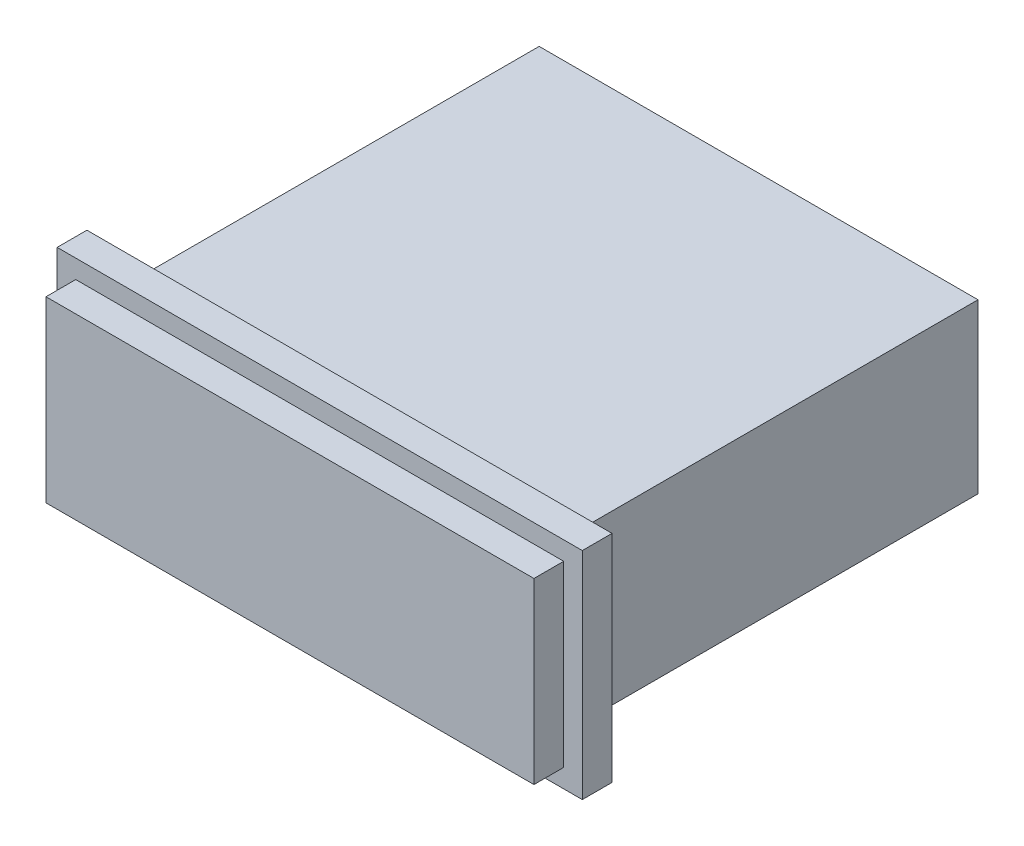
ISO-10303-21;
HEADER;
FILE_DESCRIPTION(('STEP AP214'),'2;1');
FILE_NAME('part.step','',(''),(''),'','','');
FILE_SCHEMA(('AUTOMOTIVE_DESIGN { 1 0 10303 214 1 1 1 1 }'));
ENDSEC;
DATA;
#1=APPLICATION_CONTEXT('core data for automotive mechanical design processes');
#2=APPLICATION_PROTOCOL_DEFINITION('international standard','automotive_design',2000,#1);
#3=PRODUCT_CONTEXT('',#1,'mechanical');
#4=PRODUCT('Part','Part','',(#3));
#5=PRODUCT_RELATED_PRODUCT_CATEGORY('part','',(#4));
#6=PRODUCT_DEFINITION_FORMATION('','',#4);
#7=PRODUCT_DEFINITION_CONTEXT('part definition',#1,'design');
#8=PRODUCT_DEFINITION('design','',#6,#7);
#9=PRODUCT_DEFINITION_SHAPE('','',#8);
#10=(LENGTH_UNIT() NAMED_UNIT(*) SI_UNIT(.MILLI.,.METRE.));
#11=(NAMED_UNIT(*) PLANE_ANGLE_UNIT() SI_UNIT($,.RADIAN.));
#12=(NAMED_UNIT(*) SI_UNIT($,.STERADIAN.) SOLID_ANGLE_UNIT());
#13=UNCERTAINTY_MEASURE_WITH_UNIT(LENGTH_MEASURE(1.E-05),#10,'distance_accuracy_value','');
#14=(GEOMETRIC_REPRESENTATION_CONTEXT(3) GLOBAL_UNCERTAINTY_ASSIGNED_CONTEXT((#13)) GLOBAL_UNIT_ASSIGNED_CONTEXT((#10,
#11,#12)) REPRESENTATION_CONTEXT('',''));
#15=CARTESIAN_POINT('',(0.,0.,0.));
#16=DIRECTION('',(0.,0.,1.));
#17=DIRECTION('',(1.,0.,0.));
#18=AXIS2_PLACEMENT_3D('',#15,#16,#17);
#19=CARTESIAN_POINT('',(17.65,-7.25,-4.));
#20=DIRECTION('',(1.,0.,0.));
#21=DIRECTION('',(0.,0.,-1.));
#22=AXIS2_PLACEMENT_3D('',#19,#20,#21);
#23=PLANE('',#22);
#24=DIRECTION('',(0.,0.,1.));
#25=VECTOR('',#24,1.);
#26=CARTESIAN_POINT('',(17.65,7.25,-4.));
#27=LINE('',#26,#25);
#28=CARTESIAN_POINT('',(17.65,7.25,-4.));
#29=VERTEX_POINT('',#28);
#30=CARTESIAN_POINT('',(17.65,7.25,-2.));
#31=VERTEX_POINT('',#30);
#32=EDGE_CURVE('E66',#29,#31,#27,.T.);
#33=ORIENTED_EDGE('',*,*,#32,.T.);
#34=DIRECTION('',(0.,1.,0.));
#35=VECTOR('',#34,1.);
#36=CARTESIAN_POINT('',(17.65,7.25,-2.));
#37=LINE('',#36,#35);
#38=CARTESIAN_POINT('',(17.65,-7.25,-2.));
#39=VERTEX_POINT('',#38);
#40=EDGE_CURVE('E234',#39,#31,#37,.T.);
#41=ORIENTED_EDGE('',*,*,#40,.F.);
#42=DIRECTION('',(0.,0.,1.));
#43=VECTOR('',#42,1.);
#44=CARTESIAN_POINT('',(17.65,-7.25,-4.));
#45=LINE('',#44,#43);
#46=CARTESIAN_POINT('',(17.65,-7.25,-4.));
#47=VERTEX_POINT('',#46);
#48=EDGE_CURVE('E12',#47,#39,#45,.T.);
#49=ORIENTED_EDGE('',*,*,#48,.F.);
#50=DIRECTION('',(0.,1.,0.));
#51=VECTOR('',#50,1.);
#52=CARTESIAN_POINT('',(17.65,-7.25,-4.));
#53=LINE('',#52,#51);
#54=EDGE_CURVE('E240',#47,#29,#53,.T.);
#55=ORIENTED_EDGE('',*,*,#54,.T.);
#56=EDGE_LOOP('',(#33,#41,#49,#55));
#57=FACE_BOUND('',#56,.T.);
#58=ADVANCED_FACE('F63',(#57),#23,.T.);
#59=CARTESIAN_POINT('',(-17.65,-7.25,-4.));
#60=DIRECTION('',(0.,-1.,0.));
#61=DIRECTION('',(0.,0.,-1.));
#62=AXIS2_PLACEMENT_3D('',#59,#60,#61);
#63=PLANE('',#62);
#64=ORIENTED_EDGE('',*,*,#48,.T.);
#65=DIRECTION('',(1.,0.,0.));
#66=VECTOR('',#65,1.);
#67=CARTESIAN_POINT('',(-17.65,-7.25,-2.));
#68=LINE('',#67,#66);
#69=CARTESIAN_POINT('',(-17.65,-7.25,-2.));
#70=VERTEX_POINT('',#69);
#71=EDGE_CURVE('E231',#70,#39,#68,.T.);
#72=ORIENTED_EDGE('',*,*,#71,.F.);
#73=DIRECTION('',(0.,0.,1.));
#74=VECTOR('',#73,1.);
#75=CARTESIAN_POINT('',(-17.65,-7.25,-4.));
#76=LINE('',#75,#74);
#77=CARTESIAN_POINT('',(-17.65,-7.25,-4.));
#78=VERTEX_POINT('',#77);
#79=EDGE_CURVE('E72',#78,#70,#76,.T.);
#80=ORIENTED_EDGE('',*,*,#79,.F.);
#81=DIRECTION('',(1.,0.,0.));
#82=VECTOR('',#81,1.);
#83=CARTESIAN_POINT('',(-17.65,-7.25,-4.));
#84=LINE('',#83,#82);
#85=EDGE_CURVE('E252',#78,#47,#84,.T.);
#86=ORIENTED_EDGE('',*,*,#85,.T.);
#87=EDGE_LOOP('',(#64,#72,#80,#86));
#88=FACE_BOUND('',#87,.T.);
#89=ADVANCED_FACE('F281',(#88),#63,.T.);
#90=CARTESIAN_POINT('',(-17.65,-7.25,-4.));
#91=DIRECTION('',(-1.,0.,0.));
#92=DIRECTION('',(0.,0.,1.));
#93=AXIS2_PLACEMENT_3D('',#90,#91,#92);
#94=PLANE('',#93);
#95=ORIENTED_EDGE('',*,*,#79,.T.);
#96=DIRECTION('',(0.,-1.,0.));
#97=VECTOR('',#96,1.);
#98=CARTESIAN_POINT('',(-17.65,7.25,-2.));
#99=LINE('',#98,#97);
#100=CARTESIAN_POINT('',(-17.65,7.25,-2.));
#101=VERTEX_POINT('',#100);
#102=EDGE_CURVE('E219',#101,#70,#99,.T.);
#103=ORIENTED_EDGE('',*,*,#102,.F.);
#104=DIRECTION('',(0.,0.,1.));
#105=VECTOR('',#104,1.);
#106=CARTESIAN_POINT('',(-17.65,7.25,-4.));
#107=LINE('',#106,#105);
#108=CARTESIAN_POINT('',(-17.65,7.25,-4.));
#109=VERTEX_POINT('',#108);
#110=EDGE_CURVE('E258',#109,#101,#107,.T.);
#111=ORIENTED_EDGE('',*,*,#110,.F.);
#112=DIRECTION('',(0.,-1.,0.));
#113=VECTOR('',#112,1.);
#114=CARTESIAN_POINT('',(-17.65,-7.25,-4.));
#115=LINE('',#114,#113);
#116=EDGE_CURVE('E248',#109,#78,#115,.T.);
#117=ORIENTED_EDGE('',*,*,#116,.T.);
#118=EDGE_LOOP('',(#95,#103,#111,#117));
#119=FACE_BOUND('',#118,.T.);
#120=ADVANCED_FACE('F275',(#119),#94,.T.);
#121=CARTESIAN_POINT('',(-17.65,7.25,-4.));
#122=DIRECTION('',(0.,1.,0.));
#123=DIRECTION('',(0.,0.,1.));
#124=AXIS2_PLACEMENT_3D('',#121,#122,#123);
#125=PLANE('',#124);
#126=ORIENTED_EDGE('',*,*,#110,.T.);
#127=DIRECTION('',(-1.,0.,0.));
#128=VECTOR('',#127,1.);
#129=CARTESIAN_POINT('',(-17.65,7.25,-2.));
#130=LINE('',#129,#128);
#131=EDGE_CURVE('E237',#31,#101,#130,.T.);
#132=ORIENTED_EDGE('',*,*,#131,.F.);
#133=ORIENTED_EDGE('',*,*,#32,.F.);
#134=DIRECTION('',(-1.,0.,0.));
#135=VECTOR('',#134,1.);
#136=CARTESIAN_POINT('',(-17.65,7.25,-4.));
#137=LINE('',#136,#135);
#138=EDGE_CURVE('E244',#29,#109,#137,.T.);
#139=ORIENTED_EDGE('',*,*,#138,.T.);
#140=EDGE_LOOP('',(#126,#132,#133,#139));
#141=FACE_BOUND('',#140,.T.);
#142=ADVANCED_FACE('F269',(#141),#125,.T.);
#143=CARTESIAN_POINT('',(0.,0.,-4.));
#144=DIRECTION('',(0.,0.,-1.));
#145=DIRECTION('',(-1.,0.,0.));
#146=AXIS2_PLACEMENT_3D('',#143,#144,#145);
#147=PLANE('',#146);
#148=DIRECTION('',(0.,1.,0.));
#149=VECTOR('',#148,1.);
#150=CARTESIAN_POINT('',(-14.75,-5.65,-4.));
#151=LINE('',#150,#149);
#152=CARTESIAN_POINT('',(-14.75,-5.65,-4.));
#153=VERTEX_POINT('',#152);
#154=CARTESIAN_POINT('',(-14.75,5.65,-4.));
#155=VERTEX_POINT('',#154);
#156=EDGE_CURVE('E80',#153,#155,#151,.T.);
#157=ORIENTED_EDGE('',*,*,#156,.F.);
#158=DIRECTION('',(-1.,0.,0.));
#159=VECTOR('',#158,1.);
#160=CARTESIAN_POINT('',(14.75,-5.65,-4.));
#161=LINE('',#160,#159);
#162=CARTESIAN_POINT('',(14.75,-5.65,-4.));
#163=VERTEX_POINT('',#162);
#164=EDGE_CURVE('E84',#163,#153,#161,.T.);
#165=ORIENTED_EDGE('',*,*,#164,.F.);
#166=DIRECTION('',(0.,-1.,0.));
#167=VECTOR('',#166,1.);
#168=CARTESIAN_POINT('',(14.75,-5.65,-4.));
#169=LINE('',#168,#167);
#170=CARTESIAN_POINT('',(14.75,5.65,-4.));
#171=VERTEX_POINT('',#170);
#172=EDGE_CURVE('E434',#171,#163,#169,.T.);
#173=ORIENTED_EDGE('',*,*,#172,.F.);
#174=DIRECTION('',(1.,0.,0.));
#175=VECTOR('',#174,1.);
#176=CARTESIAN_POINT('',(14.75,5.65,-4.));
#177=LINE('',#176,#175);
#178=EDGE_CURVE('E444',#155,#171,#177,.T.);
#179=ORIENTED_EDGE('',*,*,#178,.F.);
#180=EDGE_LOOP('',(#157,#165,#173,#179));
#181=FACE_BOUND('',#180,.T.);
#182=ORIENTED_EDGE('',*,*,#54,.F.);
#183=ORIENTED_EDGE('',*,*,#85,.F.);
#184=ORIENTED_EDGE('',*,*,#116,.F.);
#185=ORIENTED_EDGE('',*,*,#138,.F.);
#186=EDGE_LOOP('',(#182,#183,#184,#185));
#187=FACE_BOUND('',#186,.T.);
#188=ADVANCED_FACE('F272',(#181,#187),#147,.T.);
#189=CARTESIAN_POINT('',(0.,0.,-2.));
#190=DIRECTION('',(0.,0.,1.));
#191=DIRECTION('',(1.,0.,0.));
#192=AXIS2_PLACEMENT_3D('',#189,#190,#191);
#193=PLANE('',#192);
#194=DIRECTION('',(-1.,0.,0.));
#195=VECTOR('',#194,1.);
#196=CARTESIAN_POINT('',(-17.65,6.,-2.));
#197=LINE('',#196,#195);
#198=CARTESIAN_POINT('',(16.4,6.,-2.));
#199=VERTEX_POINT('',#198);
#200=CARTESIAN_POINT('',(-16.4,6.,-2.));
#201=VERTEX_POINT('',#200);
#202=EDGE_CURVE('E201',#199,#201,#197,.T.);
#203=ORIENTED_EDGE('',*,*,#202,.F.);
#204=DIRECTION('',(0.,1.,0.));
#205=VECTOR('',#204,1.);
#206=CARTESIAN_POINT('',(16.4,7.25,-2.));
#207=LINE('',#206,#205);
#208=CARTESIAN_POINT('',(16.4,-6.,-2.));
#209=VERTEX_POINT('',#208);
#210=EDGE_CURVE('E197',#209,#199,#207,.T.);
#211=ORIENTED_EDGE('',*,*,#210,.F.);
#212=DIRECTION('',(1.,0.,0.));
#213=VECTOR('',#212,1.);
#214=CARTESIAN_POINT('',(-17.65,-6.,-2.));
#215=LINE('',#214,#213);
#216=CARTESIAN_POINT('',(-16.4,-6.,-2.));
#217=VERTEX_POINT('',#216);
#218=EDGE_CURVE('E192',#217,#209,#215,.T.);
#219=ORIENTED_EDGE('',*,*,#218,.F.);
#220=DIRECTION('',(0.,-1.,0.));
#221=VECTOR('',#220,1.);
#222=CARTESIAN_POINT('',(-16.4,7.25,-2.));
#223=LINE('',#222,#221);
#224=EDGE_CURVE('E188',#201,#217,#223,.T.);
#225=ORIENTED_EDGE('',*,*,#224,.F.);
#226=EDGE_LOOP('',(#203,#211,#219,#225));
#227=FACE_BOUND('',#226,.T.);
#228=ORIENTED_EDGE('',*,*,#102,.T.);
#229=ORIENTED_EDGE('',*,*,#71,.T.);
#230=ORIENTED_EDGE('',*,*,#40,.T.);
#231=ORIENTED_EDGE('',*,*,#131,.T.);
#232=EDGE_LOOP('',(#228,#229,#230,#231));
#233=FACE_BOUND('',#232,.T.);
#234=ADVANCED_FACE('F279',(#227,#233),#193,.T.);
#235=CARTESIAN_POINT('',(-16.4,7.25,-2.));
#236=DIRECTION('',(-1.,0.,0.));
#237=DIRECTION('',(0.,0.,1.));
#238=AXIS2_PLACEMENT_3D('',#235,#236,#237);
#239=PLANE('',#238);
#240=DIRECTION('',(0.,-1.,0.));
#241=VECTOR('',#240,1.);
#242=CARTESIAN_POINT('',(-16.4,7.25,0.));
#243=LINE('',#242,#241);
#244=CARTESIAN_POINT('',(-16.4,6.,0.));
#245=VERTEX_POINT('',#244);
#246=CARTESIAN_POINT('',(-16.4,-6.,0.));
#247=VERTEX_POINT('',#246);
#248=EDGE_CURVE('E177',#245,#247,#243,.T.);
#249=ORIENTED_EDGE('',*,*,#248,.F.);
#250=DIRECTION('',(0.,0.,1.));
#251=VECTOR('',#250,1.);
#252=CARTESIAN_POINT('',(-16.4,6.,-2.));
#253=LINE('',#252,#251);
#254=EDGE_CURVE('E216',#201,#245,#253,.T.);
#255=ORIENTED_EDGE('',*,*,#254,.F.);
#256=ORIENTED_EDGE('',*,*,#224,.T.);
#257=DIRECTION('',(0.,0.,1.));
#258=VECTOR('',#257,1.);
#259=CARTESIAN_POINT('',(-16.4,-6.,-2.));
#260=LINE('',#259,#258);
#261=EDGE_CURVE('E204',#217,#247,#260,.T.);
#262=ORIENTED_EDGE('',*,*,#261,.T.);
#263=EDGE_LOOP('',(#249,#255,#256,#262));
#264=FACE_BOUND('',#263,.T.);
#265=ADVANCED_FACE('F299',(#264),#239,.T.);
#266=CARTESIAN_POINT('',(-17.65,6.,-2.));
#267=DIRECTION('',(0.,1.,0.));
#268=DIRECTION('',(0.,0.,1.));
#269=AXIS2_PLACEMENT_3D('',#266,#267,#268);
#270=PLANE('',#269);
#271=DIRECTION('',(-1.,0.,0.));
#272=VECTOR('',#271,1.);
#273=CARTESIAN_POINT('',(-17.65,6.,0.));
#274=LINE('',#273,#272);
#275=CARTESIAN_POINT('',(16.4,6.,0.));
#276=VERTEX_POINT('',#275);
#277=EDGE_CURVE('E193',#276,#245,#274,.T.);
#278=ORIENTED_EDGE('',*,*,#277,.F.);
#279=DIRECTION('',(0.,0.,1.));
#280=VECTOR('',#279,1.);
#281=CARTESIAN_POINT('',(16.4,6.,-2.));
#282=LINE('',#281,#280);
#283=EDGE_CURVE('E220',#199,#276,#282,.T.);
#284=ORIENTED_EDGE('',*,*,#283,.F.);
#285=ORIENTED_EDGE('',*,*,#202,.T.);
#286=ORIENTED_EDGE('',*,*,#254,.T.);
#287=EDGE_LOOP('',(#278,#284,#285,#286));
#288=FACE_BOUND('',#287,.T.);
#289=ADVANCED_FACE('F305',(#288),#270,.T.);
#290=CARTESIAN_POINT('',(16.4,7.25,-2.));
#291=DIRECTION('',(1.,0.,0.));
#292=DIRECTION('',(0.,0.,-1.));
#293=AXIS2_PLACEMENT_3D('',#290,#291,#292);
#294=PLANE('',#293);
#295=DIRECTION('',(0.,1.,0.));
#296=VECTOR('',#295,1.);
#297=CARTESIAN_POINT('',(16.4,7.25,0.));
#298=LINE('',#297,#296);
#299=CARTESIAN_POINT('',(16.4,-6.,0.));
#300=VERTEX_POINT('',#299);
#301=EDGE_CURVE('E209',#300,#276,#298,.T.);
#302=ORIENTED_EDGE('',*,*,#301,.F.);
#303=DIRECTION('',(0.,0.,1.));
#304=VECTOR('',#303,1.);
#305=CARTESIAN_POINT('',(16.4,-6.,-2.));
#306=LINE('',#305,#304);
#307=EDGE_CURVE('E223',#209,#300,#306,.T.);
#308=ORIENTED_EDGE('',*,*,#307,.F.);
#309=ORIENTED_EDGE('',*,*,#210,.T.);
#310=ORIENTED_EDGE('',*,*,#283,.T.);
#311=EDGE_LOOP('',(#302,#308,#309,#310));
#312=FACE_BOUND('',#311,.T.);
#313=ADVANCED_FACE('F310',(#312),#294,.T.);
#314=CARTESIAN_POINT('',(-17.65,-6.,-2.));
#315=DIRECTION('',(0.,-1.,0.));
#316=DIRECTION('',(0.,0.,-1.));
#317=AXIS2_PLACEMENT_3D('',#314,#315,#316);
#318=PLANE('',#317);
#319=DIRECTION('',(1.,0.,0.));
#320=VECTOR('',#319,1.);
#321=CARTESIAN_POINT('',(-17.65,-6.,0.));
#322=LINE('',#321,#320);
#323=EDGE_CURVE('E182',#247,#300,#322,.T.);
#324=ORIENTED_EDGE('',*,*,#323,.F.);
#325=ORIENTED_EDGE('',*,*,#261,.F.);
#326=ORIENTED_EDGE('',*,*,#218,.T.);
#327=ORIENTED_EDGE('',*,*,#307,.T.);
#328=EDGE_LOOP('',(#324,#325,#326,#327));
#329=FACE_BOUND('',#328,.T.);
#330=ADVANCED_FACE('F307',(#329),#318,.T.);
#331=CARTESIAN_POINT('',(0.,0.,0.));
#332=DIRECTION('',(0.,0.,-1.));
#333=DIRECTION('',(-1.,0.,0.));
#334=AXIS2_PLACEMENT_3D('',#331,#332,#333);
#335=PLANE('',#334);
#336=ORIENTED_EDGE('',*,*,#248,.T.);
#337=ORIENTED_EDGE('',*,*,#323,.T.);
#338=ORIENTED_EDGE('',*,*,#301,.T.);
#339=ORIENTED_EDGE('',*,*,#277,.T.);
#340=EDGE_LOOP('',(#336,#337,#338,#339));
#341=FACE_BOUND('',#340,.T.);
#342=ADVANCED_FACE('F290',(#341),#335,.F.);
#343=CARTESIAN_POINT('',(-14.75,-5.65,-31.5));
#344=DIRECTION('',(1.,0.,0.));
#345=DIRECTION('',(0.,0.,-1.));
#346=AXIS2_PLACEMENT_3D('',#343,#344,#345);
#347=PLANE('',#346);
#348=ORIENTED_EDGE('',*,*,#156,.T.);
#349=DIRECTION('',(0.,0.,1.));
#350=VECTOR('',#349,1.);
#351=CARTESIAN_POINT('',(-14.75,5.65,-31.5));
#352=LINE('',#351,#350);
#353=CARTESIAN_POINT('',(-14.75,5.65,-31.5));
#354=VERTEX_POINT('',#353);
#355=EDGE_CURVE('E157',#354,#155,#352,.T.);
#356=ORIENTED_EDGE('',*,*,#355,.F.);
#357=DIRECTION('',(0.,1.,0.));
#358=VECTOR('',#357,1.);
#359=CARTESIAN_POINT('',(-14.75,-5.65,-31.5));
#360=LINE('',#359,#358);
#361=CARTESIAN_POINT('',(-14.75,-5.65,-31.5));
#362=VERTEX_POINT('',#361);
#363=EDGE_CURVE('E164',#362,#354,#360,.T.);
#364=ORIENTED_EDGE('',*,*,#363,.F.);
#365=DIRECTION('',(0.,0.,1.));
#366=VECTOR('',#365,1.);
#367=CARTESIAN_POINT('',(-14.75,-5.65,-31.5));
#368=LINE('',#367,#366);
#369=EDGE_CURVE('E431',#362,#153,#368,.T.);
#370=ORIENTED_EDGE('',*,*,#369,.T.);
#371=EDGE_LOOP('',(#348,#356,#364,#370));
#372=FACE_BOUND('',#371,.T.);
#373=ADVANCED_FACE('F175',(#372),#347,.F.);
#374=CARTESIAN_POINT('',(14.75,5.65,-31.5));
#375=DIRECTION('',(0.,-1.,0.));
#376=DIRECTION('',(0.,0.,-1.));
#377=AXIS2_PLACEMENT_3D('',#374,#375,#376);
#378=PLANE('',#377);
#379=ORIENTED_EDGE('',*,*,#178,.T.);
#380=DIRECTION('',(0.,0.,1.));
#381=VECTOR('',#380,1.);
#382=CARTESIAN_POINT('',(14.75,5.65,-31.5));
#383=LINE('',#382,#381);
#384=CARTESIAN_POINT('',(14.75,5.65,-31.5));
#385=VERTEX_POINT('',#384);
#386=EDGE_CURVE('E159',#385,#171,#383,.T.);
#387=ORIENTED_EDGE('',*,*,#386,.F.);
#388=DIRECTION('',(1.,0.,0.));
#389=VECTOR('',#388,1.);
#390=CARTESIAN_POINT('',(14.75,5.65,-31.5));
#391=LINE('',#390,#389);
#392=EDGE_CURVE('E152',#354,#385,#391,.T.);
#393=ORIENTED_EDGE('',*,*,#392,.F.);
#394=ORIENTED_EDGE('',*,*,#355,.T.);
#395=EDGE_LOOP('',(#379,#387,#393,#394));
#396=FACE_BOUND('',#395,.T.);
#397=ADVANCED_FACE('F155',(#396),#378,.F.);
#398=CARTESIAN_POINT('',(14.75,-5.65,-31.5));
#399=DIRECTION('',(-1.,0.,0.));
#400=DIRECTION('',(0.,0.,1.));
#401=AXIS2_PLACEMENT_3D('',#398,#399,#400);
#402=PLANE('',#401);
#403=ORIENTED_EDGE('',*,*,#172,.T.);
#404=DIRECTION('',(0.,0.,1.));
#405=VECTOR('',#404,1.);
#406=CARTESIAN_POINT('',(14.75,-5.65,-31.5));
#407=LINE('',#406,#405);
#408=CARTESIAN_POINT('',(14.75,-5.65,-31.5));
#409=VERTEX_POINT('',#408);
#410=EDGE_CURVE('E184',#409,#163,#407,.T.);
#411=ORIENTED_EDGE('',*,*,#410,.F.);
#412=DIRECTION('',(0.,-1.,0.));
#413=VECTOR('',#412,1.);
#414=CARTESIAN_POINT('',(14.75,-5.65,-31.5));
#415=LINE('',#414,#413);
#416=EDGE_CURVE('E163',#385,#409,#415,.T.);
#417=ORIENTED_EDGE('',*,*,#416,.F.);
#418=ORIENTED_EDGE('',*,*,#386,.T.);
#419=EDGE_LOOP('',(#403,#411,#417,#418));
#420=FACE_BOUND('',#419,.T.);
#421=ADVANCED_FACE('F322',(#420),#402,.F.);
#422=CARTESIAN_POINT('',(14.75,-5.65,-31.5));
#423=DIRECTION('',(0.,1.,0.));
#424=DIRECTION('',(0.,0.,1.));
#425=AXIS2_PLACEMENT_3D('',#422,#423,#424);
#426=PLANE('',#425);
#427=ORIENTED_EDGE('',*,*,#164,.T.);
#428=ORIENTED_EDGE('',*,*,#369,.F.);
#429=DIRECTION('',(-1.,0.,0.));
#430=VECTOR('',#429,1.);
#431=CARTESIAN_POINT('',(14.75,-5.65,-31.5));
#432=LINE('',#431,#430);
#433=EDGE_CURVE('E169',#409,#362,#432,.T.);
#434=ORIENTED_EDGE('',*,*,#433,.F.);
#435=ORIENTED_EDGE('',*,*,#410,.T.);
#436=EDGE_LOOP('',(#427,#428,#434,#435));
#437=FACE_BOUND('',#436,.T.);
#438=ADVANCED_FACE('F325',(#437),#426,.F.);
#439=CARTESIAN_POINT('',(0.,0.,-31.5));
#440=DIRECTION('',(0.,0.,1.));
#441=DIRECTION('',(1.,0.,0.));
#442=AXIS2_PLACEMENT_3D('',#439,#440,#441);
#443=PLANE('',#442);
#444=ORIENTED_EDGE('',*,*,#363,.T.);
#445=ORIENTED_EDGE('',*,*,#392,.T.);
#446=ORIENTED_EDGE('',*,*,#416,.T.);
#447=ORIENTED_EDGE('',*,*,#433,.T.);
#448=EDGE_LOOP('',(#444,#445,#446,#447));
#449=FACE_BOUND('',#448,.T.);
#450=ADVANCED_FACE('F167',(#449),#443,.F.);
#451=CLOSED_SHELL('',(#58,#89,#120,#142,#188,#234,#265,#289,#313,#330,#342,#373,#397,#421,#438,#450));
#452=MANIFOLD_SOLID_BREP('B2',#451);
#453=ADVANCED_BREP_SHAPE_REPRESENTATION('',(#18,#452),#14);
#454=SHAPE_DEFINITION_REPRESENTATION(#9,#453);
ENDSEC;
END-ISO-10303-21;
